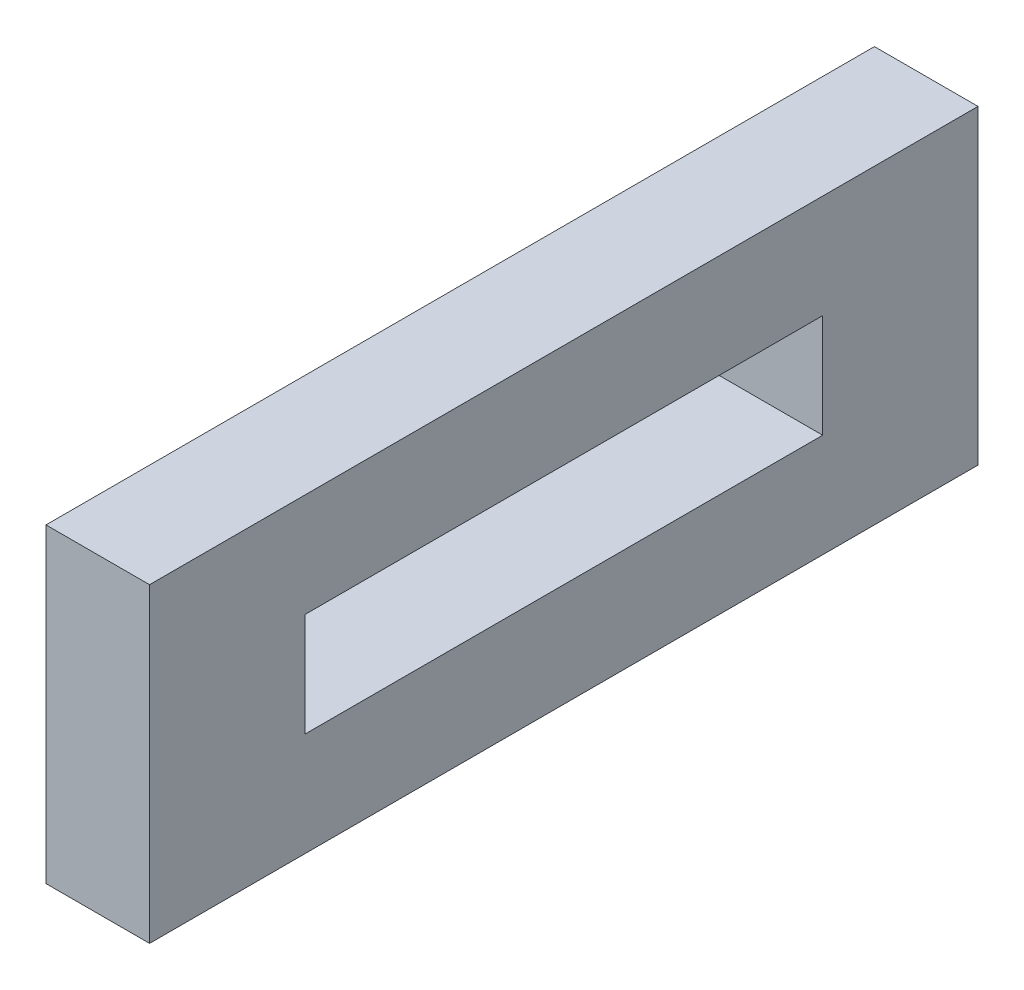
ISO-10303-21;
HEADER;
FILE_DESCRIPTION(('STEP AP214'),'2;1');
FILE_NAME('part.step','',(''),(''),'','','');
FILE_SCHEMA(('AUTOMOTIVE_DESIGN { 1 0 10303 214 1 1 1 1 }'));
ENDSEC;
DATA;
#1=APPLICATION_CONTEXT('core data for automotive mechanical design processes');
#2=APPLICATION_PROTOCOL_DEFINITION('international standard','automotive_design',2000,#1);
#3=PRODUCT_CONTEXT('',#1,'mechanical');
#4=PRODUCT('Part','Part','',(#3));
#5=PRODUCT_RELATED_PRODUCT_CATEGORY('part','',(#4));
#6=PRODUCT_DEFINITION_FORMATION('','',#4);
#7=PRODUCT_DEFINITION_CONTEXT('part definition',#1,'design');
#8=PRODUCT_DEFINITION('design','',#6,#7);
#9=PRODUCT_DEFINITION_SHAPE('','',#8);
#10=(LENGTH_UNIT() NAMED_UNIT(*) SI_UNIT(.MILLI.,.METRE.));
#11=(NAMED_UNIT(*) PLANE_ANGLE_UNIT() SI_UNIT($,.RADIAN.));
#12=(NAMED_UNIT(*) SI_UNIT($,.STERADIAN.) SOLID_ANGLE_UNIT());
#13=UNCERTAINTY_MEASURE_WITH_UNIT(LENGTH_MEASURE(1.E-05),#10,'distance_accuracy_value','');
#14=(GEOMETRIC_REPRESENTATION_CONTEXT(3) GLOBAL_UNCERTAINTY_ASSIGNED_CONTEXT((#13)) GLOBAL_UNIT_ASSIGNED_CONTEXT((#10,
#11,#12)) REPRESENTATION_CONTEXT('',''));
#15=CARTESIAN_POINT('',(0.,0.,0.));
#16=DIRECTION('',(0.,0.,1.));
#17=DIRECTION('',(1.,0.,0.));
#18=AXIS2_PLACEMENT_3D('',#15,#16,#17);
#19=CARTESIAN_POINT('',(10.,0.,0.));
#20=DIRECTION('',(1.,0.,0.));
#21=DIRECTION('',(0.,0.,-1.));
#22=AXIS2_PLACEMENT_3D('',#19,#20,#21);
#23=PLANE('',#22);
#24=DIRECTION('',(0.,1.,0.));
#25=VECTOR('',#24,1.);
#26=CARTESIAN_POINT('',(10.,15.,-40.));
#27=LINE('',#26,#25);
#28=CARTESIAN_POINT('',(10.,-15.,-40.));
#29=VERTEX_POINT('',#28);
#30=CARTESIAN_POINT('',(10.,15.,-40.));
#31=VERTEX_POINT('',#30);
#32=EDGE_CURVE('E153',#29,#31,#27,.T.);
#33=ORIENTED_EDGE('',*,*,#32,.T.);
#34=DIRECTION('',(0.,0.,1.));
#35=VECTOR('',#34,1.);
#36=CARTESIAN_POINT('',(10.,15.,40.));
#37=LINE('',#36,#35);
#38=CARTESIAN_POINT('',(10.,15.,40.));
#39=VERTEX_POINT('',#38);
#40=EDGE_CURVE('E157',#31,#39,#37,.T.);
#41=ORIENTED_EDGE('',*,*,#40,.T.);
#42=DIRECTION('',(0.,-1.,0.));
#43=VECTOR('',#42,1.);
#44=CARTESIAN_POINT('',(10.,15.,40.));
#45=LINE('',#44,#43);
#46=CARTESIAN_POINT('',(10.,-15.,40.));
#47=VERTEX_POINT('',#46);
#48=EDGE_CURVE('E161',#39,#47,#45,.T.);
#49=ORIENTED_EDGE('',*,*,#48,.T.);
#50=DIRECTION('',(0.,0.,-1.));
#51=VECTOR('',#50,1.);
#52=CARTESIAN_POINT('',(10.,-15.,40.));
#53=LINE('',#52,#51);
#54=EDGE_CURVE('E164',#47,#29,#53,.T.);
#55=ORIENTED_EDGE('',*,*,#54,.T.);
#56=EDGE_LOOP('',(#33,#41,#49,#55));
#57=FACE_BOUND('',#56,.T.);
#58=DIRECTION('',(0.,0.,1.));
#59=VECTOR('',#58,1.);
#60=CARTESIAN_POINT('',(10.,4.99999999999999,25.));
#61=LINE('',#60,#59);
#62=CARTESIAN_POINT('',(10.,4.99999999999999,-25.));
#63=VERTEX_POINT('',#62);
#64=CARTESIAN_POINT('',(10.,4.99999999999999,25.));
#65=VERTEX_POINT('',#64);
#66=EDGE_CURVE('E114',#63,#65,#61,.T.);
#67=ORIENTED_EDGE('',*,*,#66,.F.);
#68=DIRECTION('',(0.,1.,0.));
#69=VECTOR('',#68,1.);
#70=CARTESIAN_POINT('',(10.,4.99999999999999,-25.));
#71=LINE('',#70,#69);
#72=CARTESIAN_POINT('',(10.,-5.,-25.));
#73=VERTEX_POINT('',#72);
#74=EDGE_CURVE('E105',#73,#63,#71,.T.);
#75=ORIENTED_EDGE('',*,*,#74,.F.);
#76=DIRECTION('',(0.,0.,-1.));
#77=VECTOR('',#76,1.);
#78=CARTESIAN_POINT('',(10.,-5.,25.));
#79=LINE('',#78,#77);
#80=CARTESIAN_POINT('',(10.,-5.,25.));
#81=VERTEX_POINT('',#80);
#82=EDGE_CURVE('E131',#81,#73,#79,.T.);
#83=ORIENTED_EDGE('',*,*,#82,.F.);
#84=DIRECTION('',(0.,-1.,0.));
#85=VECTOR('',#84,1.);
#86=CARTESIAN_POINT('',(10.,4.99999999999999,25.));
#87=LINE('',#86,#85);
#88=EDGE_CURVE('E127',#65,#81,#87,.T.);
#89=ORIENTED_EDGE('',*,*,#88,.F.);
#90=EDGE_LOOP('',(#67,#75,#83,#89));
#91=FACE_BOUND('',#90,.T.);
#92=ADVANCED_FACE('F39',(#57,#91),#23,.T.);
#93=CARTESIAN_POINT('',(0.,0.,0.));
#94=DIRECTION('',(1.,0.,0.));
#95=DIRECTION('',(0.,0.,-1.));
#96=AXIS2_PLACEMENT_3D('',#93,#94,#95);
#97=PLANE('',#96);
#98=DIRECTION('',(0.,1.,0.));
#99=VECTOR('',#98,1.);
#100=CARTESIAN_POINT('',(0.,15.,-40.));
#101=LINE('',#100,#99);
#102=CARTESIAN_POINT('',(0.,-15.,-40.));
#103=VERTEX_POINT('',#102);
#104=CARTESIAN_POINT('',(0.,15.,-40.));
#105=VERTEX_POINT('',#104);
#106=EDGE_CURVE('E123',#103,#105,#101,.T.);
#107=ORIENTED_EDGE('',*,*,#106,.F.);
#108=DIRECTION('',(0.,0.,-1.));
#109=VECTOR('',#108,1.);
#110=CARTESIAN_POINT('',(0.,-15.,40.));
#111=LINE('',#110,#109);
#112=CARTESIAN_POINT('',(0.,-15.,40.));
#113=VERTEX_POINT('',#112);
#114=EDGE_CURVE('E158',#113,#103,#111,.T.);
#115=ORIENTED_EDGE('',*,*,#114,.F.);
#116=DIRECTION('',(0.,-1.,0.));
#117=VECTOR('',#116,1.);
#118=CARTESIAN_POINT('',(0.,15.,40.));
#119=LINE('',#118,#117);
#120=CARTESIAN_POINT('',(0.,15.,40.));
#121=VERTEX_POINT('',#120);
#122=EDGE_CURVE('E174',#121,#113,#119,.T.);
#123=ORIENTED_EDGE('',*,*,#122,.F.);
#124=DIRECTION('',(0.,0.,1.));
#125=VECTOR('',#124,1.);
#126=CARTESIAN_POINT('',(0.,15.,40.));
#127=LINE('',#126,#125);
#128=EDGE_CURVE('E171',#105,#121,#127,.T.);
#129=ORIENTED_EDGE('',*,*,#128,.F.);
#130=EDGE_LOOP('',(#107,#115,#123,#129));
#131=FACE_BOUND('',#130,.T.);
#132=DIRECTION('',(0.,1.,0.));
#133=VECTOR('',#132,1.);
#134=CARTESIAN_POINT('',(0.,4.99999999999999,-25.));
#135=LINE('',#134,#133);
#136=CARTESIAN_POINT('',(0.,-5.,-25.));
#137=VERTEX_POINT('',#136);
#138=CARTESIAN_POINT('',(0.,4.99999999999999,-25.));
#139=VERTEX_POINT('',#138);
#140=EDGE_CURVE('E63',#137,#139,#135,.T.);
#141=ORIENTED_EDGE('',*,*,#140,.T.);
#142=DIRECTION('',(0.,0.,1.));
#143=VECTOR('',#142,1.);
#144=CARTESIAN_POINT('',(0.,4.99999999999999,25.));
#145=LINE('',#144,#143);
#146=CARTESIAN_POINT('',(0.,4.99999999999999,25.));
#147=VERTEX_POINT('',#146);
#148=EDGE_CURVE('E121',#139,#147,#145,.T.);
#149=ORIENTED_EDGE('',*,*,#148,.T.);
#150=DIRECTION('',(0.,-1.,0.));
#151=VECTOR('',#150,1.);
#152=CARTESIAN_POINT('',(0.,4.99999999999999,25.));
#153=LINE('',#152,#151);
#154=CARTESIAN_POINT('',(0.,-5.,25.));
#155=VERTEX_POINT('',#154);
#156=EDGE_CURVE('E140',#147,#155,#153,.T.);
#157=ORIENTED_EDGE('',*,*,#156,.T.);
#158=DIRECTION('',(0.,0.,-1.));
#159=VECTOR('',#158,1.);
#160=CARTESIAN_POINT('',(0.,-5.,25.));
#161=LINE('',#160,#159);
#162=EDGE_CURVE('E115',#155,#137,#161,.T.);
#163=ORIENTED_EDGE('',*,*,#162,.T.);
#164=EDGE_LOOP('',(#141,#149,#157,#163));
#165=FACE_BOUND('',#164,.T.);
#166=ADVANCED_FACE('F197',(#131,#165),#97,.F.);
#167=CARTESIAN_POINT('',(10.,15.,-40.));
#168=DIRECTION('',(0.,0.,1.));
#169=DIRECTION('',(1.,0.,0.));
#170=AXIS2_PLACEMENT_3D('',#167,#168,#169);
#171=PLANE('',#170);
#172=ORIENTED_EDGE('',*,*,#106,.T.);
#173=DIRECTION('',(-1.,0.,0.));
#174=VECTOR('',#173,1.);
#175=CARTESIAN_POINT('',(10.,15.,-40.));
#176=LINE('',#175,#174);
#177=EDGE_CURVE('E11',#31,#105,#176,.T.);
#178=ORIENTED_EDGE('',*,*,#177,.F.);
#179=ORIENTED_EDGE('',*,*,#32,.F.);
#180=DIRECTION('',(-1.,0.,0.));
#181=VECTOR('',#180,1.);
#182=CARTESIAN_POINT('',(10.,-15.,-40.));
#183=LINE('',#182,#181);
#184=EDGE_CURVE('E167',#29,#103,#183,.T.);
#185=ORIENTED_EDGE('',*,*,#184,.T.);
#186=EDGE_LOOP('',(#172,#178,#179,#185));
#187=FACE_BOUND('',#186,.T.);
#188=ADVANCED_FACE('F41',(#187),#171,.F.);
#189=CARTESIAN_POINT('',(10.,15.,40.));
#190=DIRECTION('',(0.,-1.,0.));
#191=DIRECTION('',(0.,0.,-1.));
#192=AXIS2_PLACEMENT_3D('',#189,#190,#191);
#193=PLANE('',#192);
#194=ORIENTED_EDGE('',*,*,#128,.T.);
#195=DIRECTION('',(-1.,0.,0.));
#196=VECTOR('',#195,1.);
#197=CARTESIAN_POINT('',(10.,15.,40.));
#198=LINE('',#197,#196);
#199=EDGE_CURVE('E48',#39,#121,#198,.T.);
#200=ORIENTED_EDGE('',*,*,#199,.F.);
#201=ORIENTED_EDGE('',*,*,#40,.F.);
#202=ORIENTED_EDGE('',*,*,#177,.T.);
#203=EDGE_LOOP('',(#194,#200,#201,#202));
#204=FACE_BOUND('',#203,.T.);
#205=ADVANCED_FACE('F207',(#204),#193,.F.);
#206=CARTESIAN_POINT('',(10.,15.,40.));
#207=DIRECTION('',(0.,0.,-1.));
#208=DIRECTION('',(-1.,0.,0.));
#209=AXIS2_PLACEMENT_3D('',#206,#207,#208);
#210=PLANE('',#209);
#211=ORIENTED_EDGE('',*,*,#122,.T.);
#212=DIRECTION('',(-1.,0.,0.));
#213=VECTOR('',#212,1.);
#214=CARTESIAN_POINT('',(10.,-15.,40.));
#215=LINE('',#214,#213);
#216=EDGE_CURVE('E182',#47,#113,#215,.T.);
#217=ORIENTED_EDGE('',*,*,#216,.F.);
#218=ORIENTED_EDGE('',*,*,#48,.F.);
#219=ORIENTED_EDGE('',*,*,#199,.T.);
#220=EDGE_LOOP('',(#211,#217,#218,#219));
#221=FACE_BOUND('',#220,.T.);
#222=ADVANCED_FACE('F191',(#221),#210,.F.);
#223=CARTESIAN_POINT('',(10.,-15.,40.));
#224=DIRECTION('',(0.,1.,0.));
#225=DIRECTION('',(0.,0.,1.));
#226=AXIS2_PLACEMENT_3D('',#223,#224,#225);
#227=PLANE('',#226);
#228=ORIENTED_EDGE('',*,*,#114,.T.);
#229=ORIENTED_EDGE('',*,*,#184,.F.);
#230=ORIENTED_EDGE('',*,*,#54,.F.);
#231=ORIENTED_EDGE('',*,*,#216,.T.);
#232=EDGE_LOOP('',(#228,#229,#230,#231));
#233=FACE_BOUND('',#232,.T.);
#234=ADVANCED_FACE('F201',(#233),#227,.F.);
#235=CARTESIAN_POINT('',(10.,4.99999999999999,-25.));
#236=DIRECTION('',(0.,0.,1.));
#237=DIRECTION('',(0.,-1.,0.));
#238=AXIS2_PLACEMENT_3D('',#235,#236,#237);
#239=PLANE('',#238);
#240=ORIENTED_EDGE('',*,*,#140,.F.);
#241=DIRECTION('',(-1.,0.,0.));
#242=VECTOR('',#241,1.);
#243=CARTESIAN_POINT('',(10.,-5.,-25.));
#244=LINE('',#243,#242);
#245=EDGE_CURVE('E109',#73,#137,#244,.T.);
#246=ORIENTED_EDGE('',*,*,#245,.F.);
#247=ORIENTED_EDGE('',*,*,#74,.T.);
#248=DIRECTION('',(-1.,0.,0.));
#249=VECTOR('',#248,1.);
#250=CARTESIAN_POINT('',(10.,4.99999999999999,-25.));
#251=LINE('',#250,#249);
#252=EDGE_CURVE('E108',#63,#139,#251,.T.);
#253=ORIENTED_EDGE('',*,*,#252,.T.);
#254=EDGE_LOOP('',(#240,#246,#247,#253));
#255=FACE_BOUND('',#254,.T.);
#256=ADVANCED_FACE('F107',(#255),#239,.T.);
#257=CARTESIAN_POINT('',(10.,4.99999999999999,25.));
#258=DIRECTION('',(0.,-1.,0.));
#259=DIRECTION('',(0.,0.,-1.));
#260=AXIS2_PLACEMENT_3D('',#257,#258,#259);
#261=PLANE('',#260);
#262=ORIENTED_EDGE('',*,*,#148,.F.);
#263=ORIENTED_EDGE('',*,*,#252,.F.);
#264=ORIENTED_EDGE('',*,*,#66,.T.);
#265=DIRECTION('',(-1.,0.,0.));
#266=VECTOR('',#265,1.);
#267=CARTESIAN_POINT('',(10.,4.99999999999999,25.));
#268=LINE('',#267,#266);
#269=EDGE_CURVE('E124',#65,#147,#268,.T.);
#270=ORIENTED_EDGE('',*,*,#269,.T.);
#271=EDGE_LOOP('',(#262,#263,#264,#270));
#272=FACE_BOUND('',#271,.T.);
#273=ADVANCED_FACE('F118',(#272),#261,.T.);
#274=CARTESIAN_POINT('',(10.,4.99999999999999,25.));
#275=DIRECTION('',(0.,0.,-1.));
#276=DIRECTION('',(0.,1.,0.));
#277=AXIS2_PLACEMENT_3D('',#274,#275,#276);
#278=PLANE('',#277);
#279=ORIENTED_EDGE('',*,*,#156,.F.);
#280=ORIENTED_EDGE('',*,*,#269,.F.);
#281=ORIENTED_EDGE('',*,*,#88,.T.);
#282=DIRECTION('',(-1.,0.,0.));
#283=VECTOR('',#282,1.);
#284=CARTESIAN_POINT('',(10.,-5.,25.));
#285=LINE('',#284,#283);
#286=EDGE_CURVE('E55',#81,#155,#285,.T.);
#287=ORIENTED_EDGE('',*,*,#286,.T.);
#288=EDGE_LOOP('',(#279,#280,#281,#287));
#289=FACE_BOUND('',#288,.T.);
#290=ADVANCED_FACE('F230',(#289),#278,.T.);
#291=CARTESIAN_POINT('',(10.,-5.,25.));
#292=DIRECTION('',(0.,1.,0.));
#293=DIRECTION('',(0.,0.,1.));
#294=AXIS2_PLACEMENT_3D('',#291,#292,#293);
#295=PLANE('',#294);
#296=ORIENTED_EDGE('',*,*,#162,.F.);
#297=ORIENTED_EDGE('',*,*,#286,.F.);
#298=ORIENTED_EDGE('',*,*,#82,.T.);
#299=ORIENTED_EDGE('',*,*,#245,.T.);
#300=EDGE_LOOP('',(#296,#297,#298,#299));
#301=FACE_BOUND('',#300,.T.);
#302=ADVANCED_FACE('F234',(#301),#295,.T.);
#303=CLOSED_SHELL('',(#92,#166,#188,#205,#222,#234,#256,#273,#290,#302));
#304=MANIFOLD_SOLID_BREP('B2',#303);
#305=ADVANCED_BREP_SHAPE_REPRESENTATION('',(#18,#304),#14);
#306=SHAPE_DEFINITION_REPRESENTATION(#9,#305);
ENDSEC;
END-ISO-10303-21;
